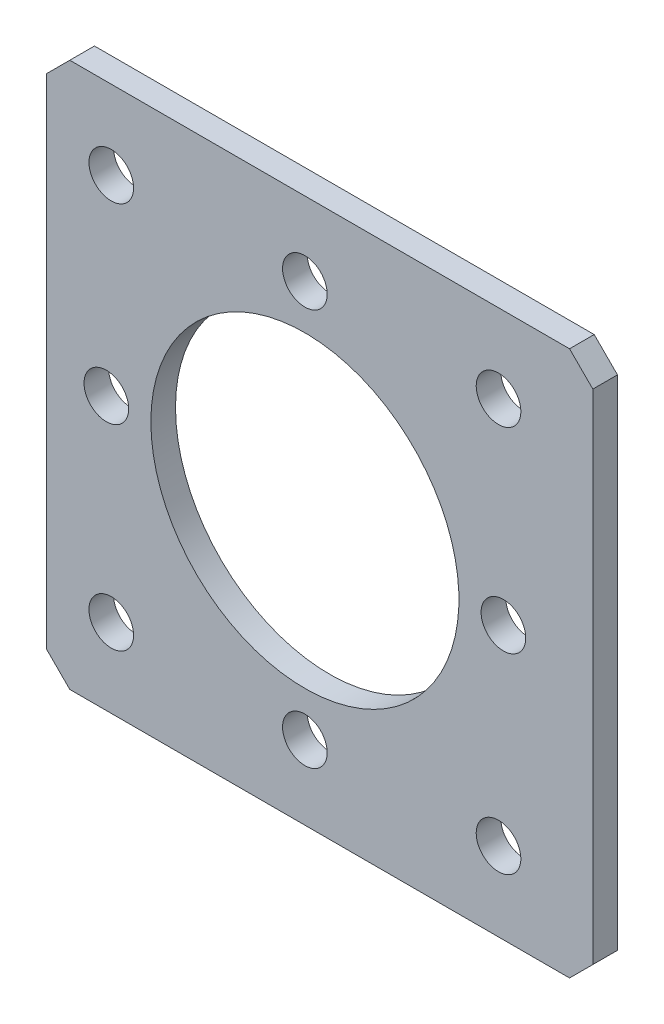
ISO-10303-21;
HEADER;
FILE_DESCRIPTION(('STEP AP214'),'2;1');
FILE_NAME('part.step','',(''),(''),'','','');
FILE_SCHEMA(('AUTOMOTIVE_DESIGN { 1 0 10303 214 1 1 1 1 }'));
ENDSEC;
DATA;
#1=APPLICATION_CONTEXT('core data for automotive mechanical design processes');
#2=APPLICATION_PROTOCOL_DEFINITION('international standard','automotive_design',2000,#1);
#3=PRODUCT_CONTEXT('',#1,'mechanical');
#4=PRODUCT('Part','Part','',(#3));
#5=PRODUCT_RELATED_PRODUCT_CATEGORY('part','',(#4));
#6=PRODUCT_DEFINITION_FORMATION('','',#4);
#7=PRODUCT_DEFINITION_CONTEXT('part definition',#1,'design');
#8=PRODUCT_DEFINITION('design','',#6,#7);
#9=PRODUCT_DEFINITION_SHAPE('','',#8);
#10=(LENGTH_UNIT() NAMED_UNIT(*) SI_UNIT(.MILLI.,.METRE.));
#11=(NAMED_UNIT(*) PLANE_ANGLE_UNIT() SI_UNIT($,.RADIAN.));
#12=(NAMED_UNIT(*) SI_UNIT($,.STERADIAN.) SOLID_ANGLE_UNIT());
#13=UNCERTAINTY_MEASURE_WITH_UNIT(LENGTH_MEASURE(1.E-05),#10,'distance_accuracy_value','');
#14=(GEOMETRIC_REPRESENTATION_CONTEXT(3) GLOBAL_UNCERTAINTY_ASSIGNED_CONTEXT((#13)) GLOBAL_UNIT_ASSIGNED_CONTEXT((#10,
#11,#12)) REPRESENTATION_CONTEXT('',''));
#15=CARTESIAN_POINT('',(0.,0.,0.));
#16=DIRECTION('',(0.,0.,1.));
#17=DIRECTION('',(1.,0.,0.));
#18=AXIS2_PLACEMENT_3D('',#15,#16,#17);
#19=CARTESIAN_POINT('',(-50.673,-25.273,0.));
#20=DIRECTION('',(0.,0.,1.));
#21=DIRECTION('',(1.,0.,0.));
#22=AXIS2_PLACEMENT_3D('',#19,#20,#21);
#23=PLANE('',#22);
#24=DIRECTION('',(0.707106781186546,-0.707106781186549,0.));
#25=VECTOR('',#24,1.);
#26=CARTESIAN_POINT('',(-2.15899999999999,25.273,0.));
#27=LINE('',#26,#25);
#28=CARTESIAN_POINT('',(-2.15900000000001,25.273,0.));
#29=VERTEX_POINT('',#28);
#30=CARTESIAN_POINT('',(0.,23.114,0.));
#31=VERTEX_POINT('',#30);
#32=EDGE_CURVE('E119',#29,#31,#27,.T.);
#33=ORIENTED_EDGE('',*,*,#32,.T.);
#34=DIRECTION('',(0.,-1.,0.));
#35=VECTOR('',#34,1.);
#36=CARTESIAN_POINT('',(0.,-25.273,0.));
#37=LINE('',#36,#35);
#38=CARTESIAN_POINT('',(0.,-23.114,0.));
#39=VERTEX_POINT('',#38);
#40=EDGE_CURVE('E102',#31,#39,#37,.T.);
#41=ORIENTED_EDGE('',*,*,#40,.T.);
#42=DIRECTION('',(-0.707106781186546,-0.707106781186549,0.));
#43=VECTOR('',#42,1.);
#44=CARTESIAN_POINT('',(-2.15899999999999,-25.273,0.));
#45=LINE('',#44,#43);
#46=CARTESIAN_POINT('',(-2.15899999999998,-25.273,0.));
#47=VERTEX_POINT('',#46);
#48=EDGE_CURVE('E118',#39,#47,#45,.T.);
#49=ORIENTED_EDGE('',*,*,#48,.T.);
#50=DIRECTION('',(1.,0.,0.));
#51=VECTOR('',#50,1.);
#52=CARTESIAN_POINT('',(-50.673,-25.273,0.));
#53=LINE('',#52,#51);
#54=CARTESIAN_POINT('',(-48.514,-25.273,0.));
#55=VERTEX_POINT('',#54);
#56=EDGE_CURVE('E139',#47,#55,#53,.F.);
#57=ORIENTED_EDGE('',*,*,#56,.T.);
#58=DIRECTION('',(-0.707106781186548,0.707106781186548,0.));
#59=VECTOR('',#58,1.);
#60=CARTESIAN_POINT('',(-48.514,-25.273,0.));
#61=LINE('',#60,#59);
#62=CARTESIAN_POINT('',(-50.673,-23.114,0.));
#63=VERTEX_POINT('',#62);
#64=EDGE_CURVE('E143',#55,#63,#61,.T.);
#65=ORIENTED_EDGE('',*,*,#64,.T.);
#66=DIRECTION('',(0.,1.,0.));
#67=VECTOR('',#66,1.);
#68=CARTESIAN_POINT('',(-50.673,25.273,0.));
#69=LINE('',#68,#67);
#70=CARTESIAN_POINT('',(-50.673,23.114,0.));
#71=VERTEX_POINT('',#70);
#72=EDGE_CURVE('E147',#63,#71,#69,.T.);
#73=ORIENTED_EDGE('',*,*,#72,.T.);
#74=DIRECTION('',(0.707106781186548,0.707106781186548,0.));
#75=VECTOR('',#74,1.);
#76=CARTESIAN_POINT('',(-50.673,23.114,0.));
#77=LINE('',#76,#75);
#78=CARTESIAN_POINT('',(-48.514,25.273,0.));
#79=VERTEX_POINT('',#78);
#80=EDGE_CURVE('E89',#71,#79,#77,.T.);
#81=ORIENTED_EDGE('',*,*,#80,.T.);
#82=DIRECTION('',(1.,0.,0.));
#83=VECTOR('',#82,1.);
#84=CARTESIAN_POINT('',(-50.673,25.273,0.));
#85=LINE('',#84,#83);
#86=EDGE_CURVE('E92',#79,#29,#85,.T.);
#87=ORIENTED_EDGE('',*,*,#86,.T.);
#88=EDGE_LOOP('',(#33,#41,#49,#57,#65,#73,#81,#87));
#89=FACE_BOUND('',#88,.T.);
#90=CARTESIAN_POINT('',(-26.7081,-18.415,0.));
#91=DIRECTION('',(0.,0.,-1.));
#92=DIRECTION('',(-1.,0.,0.));
#93=AXIS2_PLACEMENT_3D('',#90,#91,#92);
#94=CIRCLE('',#93,2.0701);
#95=CARTESIAN_POINT('',(-28.7782,-18.415,0.));
#96=VERTEX_POINT('',#95);
#97=EDGE_CURVE('E157',#96,#96,#94,.F.);
#98=ORIENTED_EDGE('',*,*,#97,.T.);
#99=EDGE_LOOP('',(#98));
#100=FACE_BOUND('',#99,.T.);
#101=CARTESIAN_POINT('',(-26.7080999999999,18.415,0.));
#102=DIRECTION('',(0.,0.,-1.));
#103=DIRECTION('',(-1.,0.,0.));
#104=AXIS2_PLACEMENT_3D('',#101,#102,#103);
#105=CIRCLE('',#104,2.0701);
#106=CARTESIAN_POINT('',(-28.7781999999999,18.415,0.));
#107=VERTEX_POINT('',#106);
#108=EDGE_CURVE('E183',#107,#107,#105,.F.);
#109=ORIENTED_EDGE('',*,*,#108,.T.);
#110=EDGE_LOOP('',(#109));
#111=FACE_BOUND('',#110,.T.);
#112=CARTESIAN_POINT('',(-8.74758775786172,17.9605122421382,0.));
#113=DIRECTION('',(0.,0.,-1.));
#114=DIRECTION('',(-1.,0.,0.));
#115=AXIS2_PLACEMENT_3D('',#112,#113,#114);
#116=CIRCLE('',#115,2.0701);
#117=CARTESIAN_POINT('',(-10.8176877578617,17.9605122421382,0.));
#118=VERTEX_POINT('',#117);
#119=EDGE_CURVE('E186',#118,#118,#116,.F.);
#120=ORIENTED_EDGE('',*,*,#119,.T.);
#121=EDGE_LOOP('',(#120));
#122=FACE_BOUND('',#121,.T.);
#123=CARTESIAN_POINT('',(-44.6686122421384,17.9605122421382,0.));
#124=DIRECTION('',(0.,0.,-1.));
#125=DIRECTION('',(-1.,0.,0.));
#126=AXIS2_PLACEMENT_3D('',#123,#124,#125);
#127=CIRCLE('',#126,2.0701);
#128=CARTESIAN_POINT('',(-46.7387122421384,17.9605122421382,0.));
#129=VERTEX_POINT('',#128);
#130=EDGE_CURVE('E189',#129,#129,#127,.F.);
#131=ORIENTED_EDGE('',*,*,#130,.T.);
#132=EDGE_LOOP('',(#131));
#133=FACE_BOUND('',#132,.T.);
#134=CARTESIAN_POINT('',(-26.7081,0.,0.));
#135=DIRECTION('',(0.,0.,-1.));
#136=DIRECTION('',(-1.,0.,0.));
#137=AXIS2_PLACEMENT_3D('',#134,#135,#136);
#138=CIRCLE('',#137,14.2875);
#139=CARTESIAN_POINT('',(-40.9956,0.,0.));
#140=VERTEX_POINT('',#139);
#141=EDGE_CURVE('E192',#140,#140,#138,.F.);
#142=ORIENTED_EDGE('',*,*,#141,.T.);
#143=EDGE_LOOP('',(#142));
#144=FACE_BOUND('',#143,.T.);
#145=CARTESIAN_POINT('',(-44.6686122421382,-17.9605122421383,0.));
#146=DIRECTION('',(0.,0.,-1.));
#147=DIRECTION('',(-1.,0.,0.));
#148=AXIS2_PLACEMENT_3D('',#145,#146,#147);
#149=CIRCLE('',#148,2.0701);
#150=CARTESIAN_POINT('',(-46.7387122421382,-17.9605122421383,0.));
#151=VERTEX_POINT('',#150);
#152=EDGE_CURVE('E195',#151,#151,#149,.F.);
#153=ORIENTED_EDGE('',*,*,#152,.T.);
#154=EDGE_LOOP('',(#153));
#155=FACE_BOUND('',#154,.T.);
#156=CARTESIAN_POINT('',(-8.7475877578617,-17.9605122421383,0.));
#157=DIRECTION('',(0.,0.,-1.));
#158=DIRECTION('',(-1.,0.,0.));
#159=AXIS2_PLACEMENT_3D('',#156,#157,#158);
#160=CIRCLE('',#159,2.0701);
#161=CARTESIAN_POINT('',(-10.8176877578617,-17.9605122421383,0.));
#162=VERTEX_POINT('',#161);
#163=EDGE_CURVE('E198',#162,#162,#160,.F.);
#164=ORIENTED_EDGE('',*,*,#163,.T.);
#165=EDGE_LOOP('',(#164));
#166=FACE_BOUND('',#165,.T.);
#167=CARTESIAN_POINT('',(-45.1231,0.,0.));
#168=DIRECTION('',(0.,0.,-1.));
#169=DIRECTION('',(-1.,0.,0.));
#170=AXIS2_PLACEMENT_3D('',#167,#168,#169);
#171=CIRCLE('',#170,2.07010000000001);
#172=CARTESIAN_POINT('',(-47.1932,0.,0.));
#173=VERTEX_POINT('',#172);
#174=EDGE_CURVE('E201',#173,#173,#171,.F.);
#175=ORIENTED_EDGE('',*,*,#174,.T.);
#176=EDGE_LOOP('',(#175));
#177=FACE_BOUND('',#176,.T.);
#178=CARTESIAN_POINT('',(-8.2931,-1.87350135405495E-13,0.));
#179=DIRECTION('',(0.,0.,-1.));
#180=DIRECTION('',(-1.,0.,0.));
#181=AXIS2_PLACEMENT_3D('',#178,#179,#180);
#182=CIRCLE('',#181,2.0701);
#183=CARTESIAN_POINT('',(-10.3632,-1.87350135405495E-13,0.));
#184=VERTEX_POINT('',#183);
#185=EDGE_CURVE('E203',#184,#184,#182,.F.);
#186=ORIENTED_EDGE('',*,*,#185,.T.);
#187=EDGE_LOOP('',(#186));
#188=FACE_BOUND('',#187,.T.);
#189=ADVANCED_FACE('F34',(#89,#100,#111,#122,#133,#144,#155,#166,#177,#188),#23,.F.);
#190=CARTESIAN_POINT('',(-8.2931,-1.87350135405495E-13,2.286));
#191=DIRECTION('',(0.,0.,-1.));
#192=DIRECTION('',(-1.,0.,0.));
#193=AXIS2_PLACEMENT_3D('',#190,#191,#192);
#194=CYLINDRICAL_SURFACE('',#193,2.0701);
#195=CARTESIAN_POINT('',(-8.2931,-1.87350135405495E-13,2.286));
#196=DIRECTION('',(0.,0.,-1.));
#197=DIRECTION('',(-1.,0.,0.));
#198=AXIS2_PLACEMENT_3D('',#195,#196,#197);
#199=CIRCLE('',#198,2.0701);
#200=CARTESIAN_POINT('',(-10.3632,-1.87350135405495E-13,2.286));
#201=VERTEX_POINT('',#200);
#202=EDGE_CURVE('E137',#201,#201,#199,.T.);
#203=ORIENTED_EDGE('',*,*,#202,.F.);
#204=EDGE_LOOP('',(#203));
#205=FACE_BOUND('',#204,.T.);
#206=ORIENTED_EDGE('',*,*,#185,.F.);
#207=EDGE_LOOP('',(#206));
#208=FACE_BOUND('',#207,.T.);
#209=ADVANCED_FACE('F238',(#205,#208),#194,.F.);
#210=CARTESIAN_POINT('',(-45.1231,0.,2.286));
#211=DIRECTION('',(0.,0.,-1.));
#212=DIRECTION('',(-1.,0.,0.));
#213=AXIS2_PLACEMENT_3D('',#210,#211,#212);
#214=CYLINDRICAL_SURFACE('',#213,2.07010000000001);
#215=CARTESIAN_POINT('',(-45.1231,0.,2.286));
#216=DIRECTION('',(0.,0.,-1.));
#217=DIRECTION('',(-1.,0.,0.));
#218=AXIS2_PLACEMENT_3D('',#215,#216,#217);
#219=CIRCLE('',#218,2.07010000000001);
#220=CARTESIAN_POINT('',(-47.1932,0.,2.286));
#221=VERTEX_POINT('',#220);
#222=EDGE_CURVE('E176',#221,#221,#219,.T.);
#223=ORIENTED_EDGE('',*,*,#222,.F.);
#224=EDGE_LOOP('',(#223));
#225=FACE_BOUND('',#224,.T.);
#226=ORIENTED_EDGE('',*,*,#174,.F.);
#227=EDGE_LOOP('',(#226));
#228=FACE_BOUND('',#227,.T.);
#229=ADVANCED_FACE('F255',(#225,#228),#214,.F.);
#230=CARTESIAN_POINT('',(-8.7475877578617,-17.9605122421383,2.286));
#231=DIRECTION('',(0.,0.,-1.));
#232=DIRECTION('',(-1.,0.,0.));
#233=AXIS2_PLACEMENT_3D('',#230,#231,#232);
#234=CYLINDRICAL_SURFACE('',#233,2.0701);
#235=CARTESIAN_POINT('',(-8.7475877578617,-17.9605122421383,2.286));
#236=DIRECTION('',(0.,0.,-1.));
#237=DIRECTION('',(-1.,0.,0.));
#238=AXIS2_PLACEMENT_3D('',#235,#236,#237);
#239=CIRCLE('',#238,2.0701);
#240=CARTESIAN_POINT('',(-10.8176877578617,-17.9605122421383,2.286));
#241=VERTEX_POINT('',#240);
#242=EDGE_CURVE('E173',#241,#241,#239,.T.);
#243=ORIENTED_EDGE('',*,*,#242,.F.);
#244=EDGE_LOOP('',(#243));
#245=FACE_BOUND('',#244,.T.);
#246=ORIENTED_EDGE('',*,*,#163,.F.);
#247=EDGE_LOOP('',(#246));
#248=FACE_BOUND('',#247,.T.);
#249=ADVANCED_FACE('F257',(#245,#248),#234,.F.);
#250=CARTESIAN_POINT('',(-44.6686122421382,-17.9605122421383,2.286));
#251=DIRECTION('',(0.,0.,-1.));
#252=DIRECTION('',(-1.,0.,0.));
#253=AXIS2_PLACEMENT_3D('',#250,#251,#252);
#254=CYLINDRICAL_SURFACE('',#253,2.0701);
#255=CARTESIAN_POINT('',(-44.6686122421382,-17.9605122421383,2.286));
#256=DIRECTION('',(0.,0.,-1.));
#257=DIRECTION('',(-1.,0.,0.));
#258=AXIS2_PLACEMENT_3D('',#255,#256,#257);
#259=CIRCLE('',#258,2.0701);
#260=CARTESIAN_POINT('',(-46.7387122421382,-17.9605122421383,2.286));
#261=VERTEX_POINT('',#260);
#262=EDGE_CURVE('E170',#261,#261,#259,.T.);
#263=ORIENTED_EDGE('',*,*,#262,.F.);
#264=EDGE_LOOP('',(#263));
#265=FACE_BOUND('',#264,.T.);
#266=ORIENTED_EDGE('',*,*,#152,.F.);
#267=EDGE_LOOP('',(#266));
#268=FACE_BOUND('',#267,.T.);
#269=ADVANCED_FACE('F265',(#265,#268),#254,.F.);
#270=CARTESIAN_POINT('',(-26.7081,0.,2.286));
#271=DIRECTION('',(0.,0.,-1.));
#272=DIRECTION('',(-1.,0.,0.));
#273=AXIS2_PLACEMENT_3D('',#270,#271,#272);
#274=CYLINDRICAL_SURFACE('',#273,14.2875);
#275=CARTESIAN_POINT('',(-26.7081,0.,2.286));
#276=DIRECTION('',(0.,0.,-1.));
#277=DIRECTION('',(-1.,0.,0.));
#278=AXIS2_PLACEMENT_3D('',#275,#276,#277);
#279=CIRCLE('',#278,14.2875);
#280=CARTESIAN_POINT('',(-40.9956,0.,2.286));
#281=VERTEX_POINT('',#280);
#282=EDGE_CURVE('E167',#281,#281,#279,.T.);
#283=ORIENTED_EDGE('',*,*,#282,.F.);
#284=EDGE_LOOP('',(#283));
#285=FACE_BOUND('',#284,.T.);
#286=ORIENTED_EDGE('',*,*,#141,.F.);
#287=EDGE_LOOP('',(#286));
#288=FACE_BOUND('',#287,.T.);
#289=ADVANCED_FACE('F310',(#285,#288),#274,.F.);
#290=CARTESIAN_POINT('',(-44.6686122421384,17.9605122421382,2.286));
#291=DIRECTION('',(0.,0.,-1.));
#292=DIRECTION('',(-1.,0.,0.));
#293=AXIS2_PLACEMENT_3D('',#290,#291,#292);
#294=CYLINDRICAL_SURFACE('',#293,2.0701);
#295=CARTESIAN_POINT('',(-44.6686122421384,17.9605122421382,2.286));
#296=DIRECTION('',(0.,0.,-1.));
#297=DIRECTION('',(-1.,0.,0.));
#298=AXIS2_PLACEMENT_3D('',#295,#296,#297);
#299=CIRCLE('',#298,2.0701);
#300=CARTESIAN_POINT('',(-46.7387122421384,17.9605122421382,2.286));
#301=VERTEX_POINT('',#300);
#302=EDGE_CURVE('E164',#301,#301,#299,.T.);
#303=ORIENTED_EDGE('',*,*,#302,.F.);
#304=EDGE_LOOP('',(#303));
#305=FACE_BOUND('',#304,.T.);
#306=ORIENTED_EDGE('',*,*,#130,.F.);
#307=EDGE_LOOP('',(#306));
#308=FACE_BOUND('',#307,.T.);
#309=ADVANCED_FACE('F306',(#305,#308),#294,.F.);
#310=CARTESIAN_POINT('',(-8.74758775786172,17.9605122421382,2.286));
#311=DIRECTION('',(0.,0.,-1.));
#312=DIRECTION('',(-1.,0.,0.));
#313=AXIS2_PLACEMENT_3D('',#310,#311,#312);
#314=CYLINDRICAL_SURFACE('',#313,2.0701);
#315=CARTESIAN_POINT('',(-8.74758775786172,17.9605122421382,2.286));
#316=DIRECTION('',(0.,0.,-1.));
#317=DIRECTION('',(-1.,0.,0.));
#318=AXIS2_PLACEMENT_3D('',#315,#316,#317);
#319=CIRCLE('',#318,2.0701);
#320=CARTESIAN_POINT('',(-10.8176877578617,17.9605122421382,2.286));
#321=VERTEX_POINT('',#320);
#322=EDGE_CURVE('E161',#321,#321,#319,.T.);
#323=ORIENTED_EDGE('',*,*,#322,.F.);
#324=EDGE_LOOP('',(#323));
#325=FACE_BOUND('',#324,.T.);
#326=ORIENTED_EDGE('',*,*,#119,.F.);
#327=EDGE_LOOP('',(#326));
#328=FACE_BOUND('',#327,.T.);
#329=ADVANCED_FACE('F302',(#325,#328),#314,.F.);
#330=CARTESIAN_POINT('',(-26.7080999999999,18.415,2.286));
#331=DIRECTION('',(0.,0.,-1.));
#332=DIRECTION('',(-1.,0.,0.));
#333=AXIS2_PLACEMENT_3D('',#330,#331,#332);
#334=CYLINDRICAL_SURFACE('',#333,2.0701);
#335=CARTESIAN_POINT('',(-26.7080999999999,18.415,2.286));
#336=DIRECTION('',(0.,0.,-1.));
#337=DIRECTION('',(-1.,0.,0.));
#338=AXIS2_PLACEMENT_3D('',#335,#336,#337);
#339=CIRCLE('',#338,2.0701);
#340=CARTESIAN_POINT('',(-28.7781999999999,18.415,2.286));
#341=VERTEX_POINT('',#340);
#342=EDGE_CURVE('E131',#341,#341,#339,.T.);
#343=ORIENTED_EDGE('',*,*,#342,.F.);
#344=EDGE_LOOP('',(#343));
#345=FACE_BOUND('',#344,.T.);
#346=ORIENTED_EDGE('',*,*,#108,.F.);
#347=EDGE_LOOP('',(#346));
#348=FACE_BOUND('',#347,.T.);
#349=ADVANCED_FACE('F298',(#345,#348),#334,.F.);
#350=CARTESIAN_POINT('',(-26.7081,-18.415,2.286));
#351=DIRECTION('',(0.,0.,-1.));
#352=DIRECTION('',(-1.,0.,0.));
#353=AXIS2_PLACEMENT_3D('',#350,#351,#352);
#354=CYLINDRICAL_SURFACE('',#353,2.0701);
#355=CARTESIAN_POINT('',(-26.7081,-18.415,2.286));
#356=DIRECTION('',(0.,0.,-1.));
#357=DIRECTION('',(-1.,0.,0.));
#358=AXIS2_PLACEMENT_3D('',#355,#356,#357);
#359=CIRCLE('',#358,2.0701);
#360=CARTESIAN_POINT('',(-28.7782,-18.415,2.286));
#361=VERTEX_POINT('',#360);
#362=EDGE_CURVE('E126',#361,#361,#359,.T.);
#363=ORIENTED_EDGE('',*,*,#362,.F.);
#364=EDGE_LOOP('',(#363));
#365=FACE_BOUND('',#364,.T.);
#366=ORIENTED_EDGE('',*,*,#97,.F.);
#367=EDGE_LOOP('',(#366));
#368=FACE_BOUND('',#367,.T.);
#369=ADVANCED_FACE('F295',(#365,#368),#354,.F.);
#370=CARTESIAN_POINT('',(-2.15899999999999,-25.273,2.286));
#371=DIRECTION('',(-0.707106781186549,0.707106781186546,0.));
#372=DIRECTION('',(-0.707106781186546,-0.707106781186549,0.));
#373=AXIS2_PLACEMENT_3D('',#370,#371,#372);
#374=PLANE('',#373);
#375=DIRECTION('',(0.,0.,1.));
#376=VECTOR('',#375,1.);
#377=CARTESIAN_POINT('',(-2.15900000000001,-25.273,2.286));
#378=LINE('',#377,#376);
#379=CARTESIAN_POINT('',(-2.159,-25.273,2.286));
#380=VERTEX_POINT('',#379);
#381=EDGE_CURVE('E135',#380,#47,#378,.F.);
#382=ORIENTED_EDGE('',*,*,#381,.T.);
#383=ORIENTED_EDGE('',*,*,#48,.F.);
#384=DIRECTION('',(0.,0.,1.));
#385=VECTOR('',#384,1.);
#386=CARTESIAN_POINT('',(0.,-23.114,2.286));
#387=LINE('',#386,#385);
#388=CARTESIAN_POINT('',(0.,-23.114,2.286));
#389=VERTEX_POINT('',#388);
#390=EDGE_CURVE('E99',#39,#389,#387,.T.);
#391=ORIENTED_EDGE('',*,*,#390,.T.);
#392=DIRECTION('',(0.707106781186552,0.707106781186544,0.));
#393=VECTOR('',#392,1.);
#394=CARTESIAN_POINT('',(-2.15900000000001,-25.273,2.286));
#395=LINE('',#394,#393);
#396=EDGE_CURVE('E116',#380,#389,#395,.T.);
#397=ORIENTED_EDGE('',*,*,#396,.F.);
#398=EDGE_LOOP('',(#382,#383,#391,#397));
#399=FACE_BOUND('',#398,.T.);
#400=ADVANCED_FACE('F115',(#399),#374,.F.);
#401=CARTESIAN_POINT('',(-2.15899999999999,25.273,2.286));
#402=DIRECTION('',(-0.707106781186549,-0.707106781186546,0.));
#403=DIRECTION('',(0.707106781186546,-0.707106781186549,0.));
#404=AXIS2_PLACEMENT_3D('',#401,#402,#403);
#405=PLANE('',#404);
#406=DIRECTION('',(-0.707106781186549,0.707106781186546,0.));
#407=VECTOR('',#406,1.);
#408=CARTESIAN_POINT('',(0.,23.114,2.286));
#409=LINE('',#408,#407);
#410=CARTESIAN_POINT('',(0.,23.114,2.286));
#411=VERTEX_POINT('',#410);
#412=CARTESIAN_POINT('',(-2.159,25.273,2.286));
#413=VERTEX_POINT('',#412);
#414=EDGE_CURVE('E125',#411,#413,#409,.T.);
#415=ORIENTED_EDGE('',*,*,#414,.F.);
#416=DIRECTION('',(0.,0.,1.));
#417=VECTOR('',#416,1.);
#418=CARTESIAN_POINT('',(0.,23.114,2.286));
#419=LINE('',#418,#417);
#420=EDGE_CURVE('E107',#31,#411,#419,.T.);
#421=ORIENTED_EDGE('',*,*,#420,.F.);
#422=ORIENTED_EDGE('',*,*,#32,.F.);
#423=DIRECTION('',(0.,0.,-1.));
#424=VECTOR('',#423,1.);
#425=CARTESIAN_POINT('',(-2.15900000000001,25.273,2.286));
#426=LINE('',#425,#424);
#427=EDGE_CURVE('E152',#29,#413,#426,.F.);
#428=ORIENTED_EDGE('',*,*,#427,.T.);
#429=EDGE_LOOP('',(#415,#421,#422,#428));
#430=FACE_BOUND('',#429,.T.);
#431=ADVANCED_FACE('F290',(#430),#405,.F.);
#432=CARTESIAN_POINT('',(-50.673,25.273,2.286));
#433=DIRECTION('',(0.,-1.,0.));
#434=DIRECTION('',(0.,0.,-1.));
#435=AXIS2_PLACEMENT_3D('',#432,#433,#434);
#436=PLANE('',#435);
#437=ORIENTED_EDGE('',*,*,#86,.F.);
#438=DIRECTION('',(0.,0.,1.));
#439=VECTOR('',#438,1.);
#440=CARTESIAN_POINT('',(-48.514,25.273,2.286));
#441=LINE('',#440,#439);
#442=CARTESIAN_POINT('',(-48.514,25.273,2.286));
#443=VERTEX_POINT('',#442);
#444=EDGE_CURVE('E149',#79,#443,#441,.T.);
#445=ORIENTED_EDGE('',*,*,#444,.T.);
#446=DIRECTION('',(1.,0.,0.));
#447=VECTOR('',#446,1.);
#448=CARTESIAN_POINT('',(-50.673,25.273,2.286));
#449=LINE('',#448,#447);
#450=EDGE_CURVE('E128',#413,#443,#449,.F.);
#451=ORIENTED_EDGE('',*,*,#450,.F.);
#452=ORIENTED_EDGE('',*,*,#427,.F.);
#453=EDGE_LOOP('',(#437,#445,#451,#452));
#454=FACE_BOUND('',#453,.T.);
#455=ADVANCED_FACE('F222',(#454),#436,.F.);
#456=CARTESIAN_POINT('',(-50.673,23.114,2.286));
#457=DIRECTION('',(0.707106781186548,-0.707106781186548,0.));
#458=DIRECTION('',(0.707106781186548,0.707106781186548,0.));
#459=AXIS2_PLACEMENT_3D('',#456,#457,#458);
#460=PLANE('',#459);
#461=ORIENTED_EDGE('',*,*,#444,.F.);
#462=ORIENTED_EDGE('',*,*,#80,.F.);
#463=DIRECTION('',(0.,0.,-1.));
#464=VECTOR('',#463,1.);
#465=CARTESIAN_POINT('',(-50.673,23.114,2.286));
#466=LINE('',#465,#464);
#467=CARTESIAN_POINT('',(-50.673,23.114,2.286));
#468=VERTEX_POINT('',#467);
#469=EDGE_CURVE('E145',#71,#468,#466,.F.);
#470=ORIENTED_EDGE('',*,*,#469,.T.);
#471=DIRECTION('',(-0.707106781186549,-0.707106781186546,0.));
#472=VECTOR('',#471,1.);
#473=CARTESIAN_POINT('',(-48.514,25.273,2.286));
#474=LINE('',#473,#472);
#475=EDGE_CURVE('E215',#443,#468,#474,.T.);
#476=ORIENTED_EDGE('',*,*,#475,.F.);
#477=EDGE_LOOP('',(#461,#462,#470,#476));
#478=FACE_BOUND('',#477,.T.);
#479=ADVANCED_FACE('F225',(#478),#460,.F.);
#480=CARTESIAN_POINT('',(-50.673,25.273,2.286));
#481=DIRECTION('',(1.,0.,0.));
#482=DIRECTION('',(0.,0.,-1.));
#483=AXIS2_PLACEMENT_3D('',#480,#481,#482);
#484=PLANE('',#483);
#485=ORIENTED_EDGE('',*,*,#469,.F.);
#486=ORIENTED_EDGE('',*,*,#72,.F.);
#487=DIRECTION('',(0.,0.,1.));
#488=VECTOR('',#487,1.);
#489=CARTESIAN_POINT('',(-50.673,-23.114,2.286));
#490=LINE('',#489,#488);
#491=CARTESIAN_POINT('',(-50.673,-23.114,2.286));
#492=VERTEX_POINT('',#491);
#493=EDGE_CURVE('E141',#63,#492,#490,.T.);
#494=ORIENTED_EDGE('',*,*,#493,.T.);
#495=DIRECTION('',(0.,1.,0.));
#496=VECTOR('',#495,1.);
#497=CARTESIAN_POINT('',(-50.673,-25.273,2.286));
#498=LINE('',#497,#496);
#499=EDGE_CURVE('E212',#468,#492,#498,.F.);
#500=ORIENTED_EDGE('',*,*,#499,.F.);
#501=EDGE_LOOP('',(#485,#486,#494,#500));
#502=FACE_BOUND('',#501,.T.);
#503=ADVANCED_FACE('F230',(#502),#484,.F.);
#504=CARTESIAN_POINT('',(-48.514,-25.273,2.286));
#505=DIRECTION('',(0.707106781186548,0.707106781186548,0.));
#506=DIRECTION('',(-0.707106781186548,0.707106781186548,0.));
#507=AXIS2_PLACEMENT_3D('',#504,#505,#506);
#508=PLANE('',#507);
#509=ORIENTED_EDGE('',*,*,#493,.F.);
#510=ORIENTED_EDGE('',*,*,#64,.F.);
#511=DIRECTION('',(0.,0.,1.));
#512=VECTOR('',#511,1.);
#513=CARTESIAN_POINT('',(-48.514,-25.273,2.286));
#514=LINE('',#513,#512);
#515=CARTESIAN_POINT('',(-48.514,-25.273,2.286));
#516=VERTEX_POINT('',#515);
#517=EDGE_CURVE('E50',#55,#516,#514,.T.);
#518=ORIENTED_EDGE('',*,*,#517,.T.);
#519=DIRECTION('',(0.707106781186545,-0.70710678118655,0.));
#520=VECTOR('',#519,1.);
#521=CARTESIAN_POINT('',(-50.673,-23.114,2.286));
#522=LINE('',#521,#520);
#523=EDGE_CURVE('E210',#492,#516,#522,.T.);
#524=ORIENTED_EDGE('',*,*,#523,.F.);
#525=EDGE_LOOP('',(#509,#510,#518,#524));
#526=FACE_BOUND('',#525,.T.);
#527=ADVANCED_FACE('F232',(#526),#508,.F.);
#528=CARTESIAN_POINT('',(-50.673,-25.273,2.286));
#529=DIRECTION('',(0.,1.,0.));
#530=DIRECTION('',(0.,0.,1.));
#531=AXIS2_PLACEMENT_3D('',#528,#529,#530);
#532=PLANE('',#531);
#533=DIRECTION('',(1.,0.,0.));
#534=VECTOR('',#533,1.);
#535=CARTESIAN_POINT('',(-50.673,-25.273,2.286));
#536=LINE('',#535,#534);
#537=EDGE_CURVE('E42',#516,#380,#536,.T.);
#538=ORIENTED_EDGE('',*,*,#537,.F.);
#539=ORIENTED_EDGE('',*,*,#517,.F.);
#540=ORIENTED_EDGE('',*,*,#56,.F.);
#541=ORIENTED_EDGE('',*,*,#381,.F.);
#542=EDGE_LOOP('',(#538,#539,#540,#541));
#543=FACE_BOUND('',#542,.T.);
#544=ADVANCED_FACE('F235',(#543),#532,.F.);
#545=CARTESIAN_POINT('',(-50.673,-25.273,2.286));
#546=DIRECTION('',(0.,0.,1.));
#547=DIRECTION('',(1.,0.,0.));
#548=AXIS2_PLACEMENT_3D('',#545,#546,#547);
#549=PLANE('',#548);
#550=DIRECTION('',(0.,-1.,0.));
#551=VECTOR('',#550,1.);
#552=CARTESIAN_POINT('',(0.,-25.273,2.286));
#553=LINE('',#552,#551);
#554=EDGE_CURVE('E11',#411,#389,#553,.T.);
#555=ORIENTED_EDGE('',*,*,#554,.F.);
#556=ORIENTED_EDGE('',*,*,#414,.T.);
#557=ORIENTED_EDGE('',*,*,#450,.T.);
#558=ORIENTED_EDGE('',*,*,#475,.T.);
#559=ORIENTED_EDGE('',*,*,#499,.T.);
#560=ORIENTED_EDGE('',*,*,#523,.T.);
#561=ORIENTED_EDGE('',*,*,#537,.T.);
#562=ORIENTED_EDGE('',*,*,#396,.T.);
#563=EDGE_LOOP('',(#555,#556,#557,#558,#559,#560,#561,#562));
#564=FACE_BOUND('',#563,.T.);
#565=ORIENTED_EDGE('',*,*,#362,.T.);
#566=EDGE_LOOP('',(#565));
#567=FACE_BOUND('',#566,.T.);
#568=ORIENTED_EDGE('',*,*,#342,.T.);
#569=EDGE_LOOP('',(#568));
#570=FACE_BOUND('',#569,.T.);
#571=ORIENTED_EDGE('',*,*,#322,.T.);
#572=EDGE_LOOP('',(#571));
#573=FACE_BOUND('',#572,.T.);
#574=ORIENTED_EDGE('',*,*,#302,.T.);
#575=EDGE_LOOP('',(#574));
#576=FACE_BOUND('',#575,.T.);
#577=ORIENTED_EDGE('',*,*,#282,.T.);
#578=EDGE_LOOP('',(#577));
#579=FACE_BOUND('',#578,.T.);
#580=ORIENTED_EDGE('',*,*,#262,.T.);
#581=EDGE_LOOP('',(#580));
#582=FACE_BOUND('',#581,.T.);
#583=ORIENTED_EDGE('',*,*,#242,.T.);
#584=EDGE_LOOP('',(#583));
#585=FACE_BOUND('',#584,.T.);
#586=ORIENTED_EDGE('',*,*,#222,.T.);
#587=EDGE_LOOP('',(#586));
#588=FACE_BOUND('',#587,.T.);
#589=ORIENTED_EDGE('',*,*,#202,.T.);
#590=EDGE_LOOP('',(#589));
#591=FACE_BOUND('',#590,.T.);
#592=ADVANCED_FACE('F122',(#564,#567,#570,#573,#576,#579,#582,#585,#588,#591),#549,.T.);
#593=CARTESIAN_POINT('',(0.,-35.2697683762254,-0.254));
#594=DIRECTION('',(-1.,0.,0.));
#595=DIRECTION('',(0.,0.,1.));
#596=AXIS2_PLACEMENT_3D('',#593,#594,#595);
#597=PLANE('',#596);
#598=ORIENTED_EDGE('',*,*,#40,.F.);
#599=ORIENTED_EDGE('',*,*,#420,.T.);
#600=ORIENTED_EDGE('',*,*,#554,.T.);
#601=ORIENTED_EDGE('',*,*,#390,.F.);
#602=EDGE_LOOP('',(#598,#599,#600,#601));
#603=FACE_BOUND('',#602,.T.);
#604=ADVANCED_FACE('F105',(#603),#597,.F.);
#605=CLOSED_SHELL('',(#189,#209,#229,#249,#269,#289,#309,#329,#349,#369,#400,#431,#455,#479,
#503,#527,#544,#592,#604));
#606=MANIFOLD_SOLID_BREP('B2',#605);
#607=ADVANCED_BREP_SHAPE_REPRESENTATION('',(#18,#606),#14);
#608=SHAPE_DEFINITION_REPRESENTATION(#9,#607);
ENDSEC;
END-ISO-10303-21;
